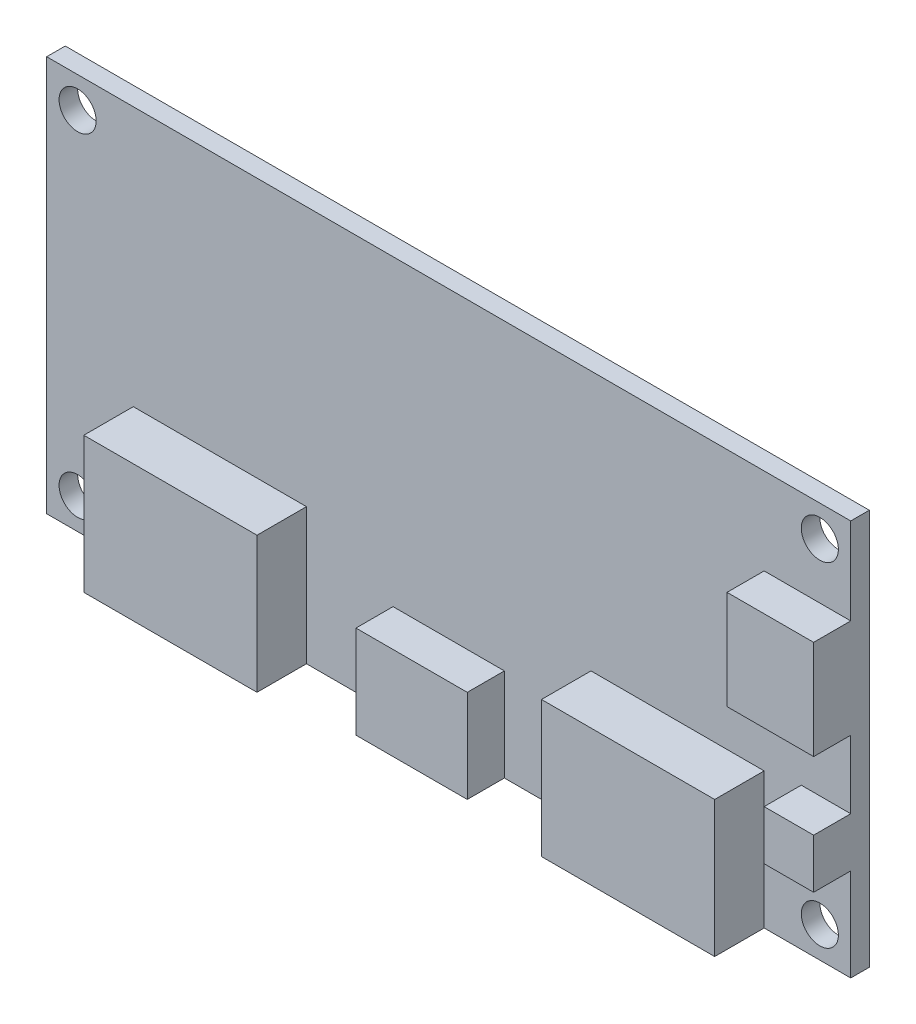
ISO-10303-21;
HEADER;
FILE_DESCRIPTION(('STEP AP214'),'2;1');
FILE_NAME('part.step','',(''),(''),'','','');
FILE_SCHEMA(('AUTOMOTIVE_DESIGN { 1 0 10303 214 1 1 1 1 }'));
ENDSEC;
DATA;
#1=APPLICATION_CONTEXT('core data for automotive mechanical design processes');
#2=APPLICATION_PROTOCOL_DEFINITION('international standard','automotive_design',2000,#1);
#3=PRODUCT_CONTEXT('',#1,'mechanical');
#4=PRODUCT('Part','Part','',(#3));
#5=PRODUCT_RELATED_PRODUCT_CATEGORY('part','',(#4));
#6=PRODUCT_DEFINITION_FORMATION('','',#4);
#7=PRODUCT_DEFINITION_CONTEXT('part definition',#1,'design');
#8=PRODUCT_DEFINITION('design','',#6,#7);
#9=PRODUCT_DEFINITION_SHAPE('','',#8);
#10=(LENGTH_UNIT() NAMED_UNIT(*) SI_UNIT(.MILLI.,.METRE.));
#11=(NAMED_UNIT(*) PLANE_ANGLE_UNIT() SI_UNIT($,.RADIAN.));
#12=(NAMED_UNIT(*) SI_UNIT($,.STERADIAN.) SOLID_ANGLE_UNIT());
#13=UNCERTAINTY_MEASURE_WITH_UNIT(LENGTH_MEASURE(1.E-05),#10,'distance_accuracy_value','');
#14=(GEOMETRIC_REPRESENTATION_CONTEXT(3) GLOBAL_UNCERTAINTY_ASSIGNED_CONTEXT((#13)) GLOBAL_UNIT_ASSIGNED_CONTEXT((#10,
#11,#12)) REPRESENTATION_CONTEXT('',''));
#15=CARTESIAN_POINT('',(0.,0.,0.));
#16=DIRECTION('',(0.,0.,1.));
#17=DIRECTION('',(1.,0.,0.));
#18=AXIS2_PLACEMENT_3D('',#15,#16,#17);
#19=CARTESIAN_POINT('',(0.,0.,1.5));
#20=DIRECTION('',(0.,0.,-1.));
#21=DIRECTION('',(-1.,0.,0.));
#22=AXIS2_PLACEMENT_3D('',#19,#20,#21);
#23=PLANE('',#22);
#24=CARTESIAN_POINT('',(62.5,2.5,1.5));
#25=DIRECTION('',(0.,0.,1.));
#26=DIRECTION('',(1.,0.,0.));
#27=AXIS2_PLACEMENT_3D('',#24,#25,#26);
#28=CIRCLE('',#27,1.5);
#29=CARTESIAN_POINT('',(64.,2.5,1.5));
#30=VERTEX_POINT('',#29);
#31=EDGE_CURVE('E341',#30,#30,#28,.T.);
#32=ORIENTED_EDGE('',*,*,#31,.F.);
#33=EDGE_LOOP('',(#32));
#34=FACE_BOUND('',#33,.T.);
#35=CARTESIAN_POINT('',(62.5,29.5,1.5));
#36=DIRECTION('',(0.,0.,1.));
#37=DIRECTION('',(1.,0.,0.));
#38=AXIS2_PLACEMENT_3D('',#35,#36,#37);
#39=CIRCLE('',#38,1.5);
#40=CARTESIAN_POINT('',(64.,29.5,1.5));
#41=VERTEX_POINT('',#40);
#42=EDGE_CURVE('E347',#41,#41,#39,.T.);
#43=ORIENTED_EDGE('',*,*,#42,.F.);
#44=EDGE_LOOP('',(#43));
#45=FACE_BOUND('',#44,.T.);
#46=CARTESIAN_POINT('',(2.5,29.5,1.5));
#47=DIRECTION('',(0.,0.,1.));
#48=DIRECTION('',(1.,0.,0.));
#49=AXIS2_PLACEMENT_3D('',#46,#47,#48);
#50=CIRCLE('',#49,1.5);
#51=CARTESIAN_POINT('',(4.,29.5,1.5));
#52=VERTEX_POINT('',#51);
#53=EDGE_CURVE('E353',#52,#52,#50,.T.);
#54=ORIENTED_EDGE('',*,*,#53,.F.);
#55=EDGE_LOOP('',(#54));
#56=FACE_BOUND('',#55,.T.);
#57=CARTESIAN_POINT('',(2.5,2.5,1.5));
#58=DIRECTION('',(0.,0.,1.));
#59=DIRECTION('',(1.,0.,0.));
#60=AXIS2_PLACEMENT_3D('',#57,#58,#59);
#61=CIRCLE('',#60,1.5);
#62=CARTESIAN_POINT('',(4.,2.5,1.5));
#63=VERTEX_POINT('',#62);
#64=EDGE_CURVE('E359',#63,#63,#61,.T.);
#65=ORIENTED_EDGE('',*,*,#64,.F.);
#66=EDGE_LOOP('',(#65));
#67=FACE_BOUND('',#66,.T.);
#68=DIRECTION('',(0.,-1.,0.));
#69=VECTOR('',#68,1.);
#70=CARTESIAN_POINT('',(28.,7.5,1.5));
#71=LINE('',#70,#69);
#72=CARTESIAN_POINT('',(28.,7.5,1.5));
#73=VERTEX_POINT('',#72);
#74=CARTESIAN_POINT('',(28.,0.,1.5));
#75=VERTEX_POINT('',#74);
#76=EDGE_CURVE('E48',#73,#75,#71,.T.);
#77=ORIENTED_EDGE('',*,*,#76,.F.);
#78=DIRECTION('',(-1.,0.,0.));
#79=VECTOR('',#78,1.);
#80=CARTESIAN_POINT('',(28.,7.5,1.5));
#81=LINE('',#80,#79);
#82=CARTESIAN_POINT('',(37.,7.5,1.5));
#83=VERTEX_POINT('',#82);
#84=EDGE_CURVE('E52',#83,#73,#81,.T.);
#85=ORIENTED_EDGE('',*,*,#84,.F.);
#86=DIRECTION('',(0.,1.,0.));
#87=VECTOR('',#86,1.);
#88=CARTESIAN_POINT('',(37.,7.5,1.5));
#89=LINE('',#88,#87);
#90=CARTESIAN_POINT('',(37.,0.,1.5));
#91=VERTEX_POINT('',#90);
#92=EDGE_CURVE('E719',#91,#83,#89,.T.);
#93=ORIENTED_EDGE('',*,*,#92,.F.);
#94=DIRECTION('',(1.,0.,0.));
#95=VECTOR('',#94,1.);
#96=CARTESIAN_POINT('',(0.,0.,1.5));
#97=LINE('',#96,#95);
#98=CARTESIAN_POINT('',(44.,0.,1.5));
#99=VERTEX_POINT('',#98);
#100=EDGE_CURVE('E374',#91,#99,#97,.T.);
#101=ORIENTED_EDGE('',*,*,#100,.T.);
#102=DIRECTION('',(0.,-1.,0.));
#103=VECTOR('',#102,1.);
#104=CARTESIAN_POINT('',(44.,11.,1.5));
#105=LINE('',#104,#103);
#106=CARTESIAN_POINT('',(44.,11.,1.5));
#107=VERTEX_POINT('',#106);
#108=EDGE_CURVE('E280',#107,#99,#105,.T.);
#109=ORIENTED_EDGE('',*,*,#108,.F.);
#110=DIRECTION('',(-1.,0.,0.));
#111=VECTOR('',#110,1.);
#112=CARTESIAN_POINT('',(44.,11.,1.5));
#113=LINE('',#112,#111);
#114=CARTESIAN_POINT('',(58.,11.,1.5));
#115=VERTEX_POINT('',#114);
#116=EDGE_CURVE('E285',#115,#107,#113,.T.);
#117=ORIENTED_EDGE('',*,*,#116,.F.);
#118=DIRECTION('',(0.,1.,0.));
#119=VECTOR('',#118,1.);
#120=CARTESIAN_POINT('',(58.,11.,1.5));
#121=LINE('',#120,#119);
#122=CARTESIAN_POINT('',(58.,0.,1.5));
#123=VERTEX_POINT('',#122);
#124=EDGE_CURVE('E294',#123,#115,#121,.T.);
#125=ORIENTED_EDGE('',*,*,#124,.F.);
#126=CARTESIAN_POINT('',(65.,0.,1.5));
#127=VERTEX_POINT('',#126);
#128=EDGE_CURVE('E368',#123,#127,#97,.T.);
#129=ORIENTED_EDGE('',*,*,#128,.T.);
#130=DIRECTION('',(0.,1.,0.));
#131=VECTOR('',#130,1.);
#132=CARTESIAN_POINT('',(65.,0.,1.5));
#133=LINE('',#132,#131);
#134=CARTESIAN_POINT('',(65.,7.5,1.5));
#135=VERTEX_POINT('',#134);
#136=EDGE_CURVE('E375',#127,#135,#133,.T.);
#137=ORIENTED_EDGE('',*,*,#136,.T.);
#138=DIRECTION('',(1.,0.,0.));
#139=VECTOR('',#138,1.);
#140=CARTESIAN_POINT('',(61.,7.5,1.5));
#141=LINE('',#140,#139);
#142=CARTESIAN_POINT('',(61.,7.5,1.5));
#143=VERTEX_POINT('',#142);
#144=EDGE_CURVE('E218',#143,#135,#141,.T.);
#145=ORIENTED_EDGE('',*,*,#144,.F.);
#146=DIRECTION('',(0.,-1.,0.));
#147=VECTOR('',#146,1.);
#148=CARTESIAN_POINT('',(61.,11.5,1.5));
#149=LINE('',#148,#147);
#150=CARTESIAN_POINT('',(61.,11.5,1.5));
#151=VERTEX_POINT('',#150);
#152=EDGE_CURVE('E215',#151,#143,#149,.T.);
#153=ORIENTED_EDGE('',*,*,#152,.F.);
#154=DIRECTION('',(-1.,0.,0.));
#155=VECTOR('',#154,1.);
#156=CARTESIAN_POINT('',(61.,11.5,1.5));
#157=LINE('',#156,#155);
#158=CARTESIAN_POINT('',(65.,11.5,1.5));
#159=VERTEX_POINT('',#158);
#160=EDGE_CURVE('E228',#159,#151,#157,.T.);
#161=ORIENTED_EDGE('',*,*,#160,.F.);
#162=CARTESIAN_POINT('',(65.,17.,1.5));
#163=VERTEX_POINT('',#162);
#164=EDGE_CURVE('E378',#159,#163,#133,.T.);
#165=ORIENTED_EDGE('',*,*,#164,.T.);
#166=DIRECTION('',(1.,0.,0.));
#167=VECTOR('',#166,1.);
#168=CARTESIAN_POINT('',(58.,17.,1.5));
#169=LINE('',#168,#167);
#170=CARTESIAN_POINT('',(58.,17.,1.5));
#171=VERTEX_POINT('',#170);
#172=EDGE_CURVE('E264',#171,#163,#169,.T.);
#173=ORIENTED_EDGE('',*,*,#172,.F.);
#174=DIRECTION('',(0.,-1.,0.));
#175=VECTOR('',#174,1.);
#176=CARTESIAN_POINT('',(58.,25.,1.5));
#177=LINE('',#176,#175);
#178=CARTESIAN_POINT('',(58.,25.,1.5));
#179=VERTEX_POINT('',#178);
#180=EDGE_CURVE('E250',#179,#171,#177,.T.);
#181=ORIENTED_EDGE('',*,*,#180,.F.);
#182=DIRECTION('',(-1.,0.,0.));
#183=VECTOR('',#182,1.);
#184=CARTESIAN_POINT('',(58.,25.,1.5));
#185=LINE('',#184,#183);
#186=CARTESIAN_POINT('',(65.,25.,1.5));
#187=VERTEX_POINT('',#186);
#188=EDGE_CURVE('E255',#187,#179,#185,.T.);
#189=ORIENTED_EDGE('',*,*,#188,.F.);
#190=CARTESIAN_POINT('',(65.,32.,1.5));
#191=VERTEX_POINT('',#190);
#192=EDGE_CURVE('E372',#187,#191,#133,.T.);
#193=ORIENTED_EDGE('',*,*,#192,.T.);
#194=DIRECTION('',(-1.,0.,0.));
#195=VECTOR('',#194,1.);
#196=CARTESIAN_POINT('',(0.,32.,1.5));
#197=LINE('',#196,#195);
#198=CARTESIAN_POINT('',(0.,32.,1.5));
#199=VERTEX_POINT('',#198);
#200=EDGE_CURVE('E377',#191,#199,#197,.T.);
#201=ORIENTED_EDGE('',*,*,#200,.T.);
#202=DIRECTION('',(0.,-1.,0.));
#203=VECTOR('',#202,1.);
#204=CARTESIAN_POINT('',(0.,0.,1.5));
#205=LINE('',#204,#203);
#206=CARTESIAN_POINT('',(0.,0.,1.5));
#207=VERTEX_POINT('',#206);
#208=EDGE_CURVE('E365',#199,#207,#205,.T.);
#209=ORIENTED_EDGE('',*,*,#208,.T.);
#210=CARTESIAN_POINT('',(7.00000000000001,0.,1.5));
#211=VERTEX_POINT('',#210);
#212=EDGE_CURVE('E370',#207,#211,#97,.T.);
#213=ORIENTED_EDGE('',*,*,#212,.T.);
#214=DIRECTION('',(0.,-1.,0.));
#215=VECTOR('',#214,1.);
#216=CARTESIAN_POINT('',(7.,11.,1.5));
#217=LINE('',#216,#215);
#218=CARTESIAN_POINT('',(7.,11.,1.5));
#219=VERTEX_POINT('',#218);
#220=EDGE_CURVE('E310',#219,#211,#217,.T.);
#221=ORIENTED_EDGE('',*,*,#220,.F.);
#222=DIRECTION('',(-1.,0.,0.));
#223=VECTOR('',#222,1.);
#224=CARTESIAN_POINT('',(7.,11.,1.5));
#225=LINE('',#224,#223);
#226=CARTESIAN_POINT('',(21.,11.,1.5));
#227=VERTEX_POINT('',#226);
#228=EDGE_CURVE('E315',#227,#219,#225,.T.);
#229=ORIENTED_EDGE('',*,*,#228,.F.);
#230=DIRECTION('',(0.,1.,0.));
#231=VECTOR('',#230,1.);
#232=CARTESIAN_POINT('',(21.,11.,1.5));
#233=LINE('',#232,#231);
#234=CARTESIAN_POINT('',(21.,0.,1.5));
#235=VERTEX_POINT('',#234);
#236=EDGE_CURVE('E324',#235,#227,#233,.T.);
#237=ORIENTED_EDGE('',*,*,#236,.F.);
#238=EDGE_CURVE('E373',#235,#75,#97,.T.);
#239=ORIENTED_EDGE('',*,*,#238,.T.);
#240=EDGE_LOOP('',(#77,#85,#93,#101,#109,#117,#125,#129,#137,#145,#153,#161,#165,#173,#181,#189,
#193,#201,#209,#213,#221,#229,#237,#239));
#241=FACE_BOUND('',#240,.T.);
#242=ADVANCED_FACE('F33',(#34,#45,#56,#67,#241),#23,.F.);
#243=CARTESIAN_POINT('',(0.,0.,0.));
#244=DIRECTION('',(0.,0.,-1.));
#245=DIRECTION('',(-1.,0.,0.));
#246=AXIS2_PLACEMENT_3D('',#243,#244,#245);
#247=PLANE('',#246);
#248=CARTESIAN_POINT('',(62.5,29.5,0.));
#249=DIRECTION('',(0.,0.,1.));
#250=DIRECTION('',(1.,0.,0.));
#251=AXIS2_PLACEMENT_3D('',#248,#249,#250);
#252=CIRCLE('',#251,1.5);
#253=CARTESIAN_POINT('',(64.,29.5,0.));
#254=VERTEX_POINT('',#253);
#255=EDGE_CURVE('E344',#254,#254,#252,.T.);
#256=ORIENTED_EDGE('',*,*,#255,.T.);
#257=EDGE_LOOP('',(#256));
#258=FACE_BOUND('',#257,.T.);
#259=CARTESIAN_POINT('',(2.5,2.5,0.));
#260=DIRECTION('',(0.,0.,1.));
#261=DIRECTION('',(1.,0.,0.));
#262=AXIS2_PLACEMENT_3D('',#259,#260,#261);
#263=CIRCLE('',#262,1.5);
#264=CARTESIAN_POINT('',(4.,2.5,0.));
#265=VERTEX_POINT('',#264);
#266=EDGE_CURVE('E356',#265,#265,#263,.T.);
#267=ORIENTED_EDGE('',*,*,#266,.T.);
#268=EDGE_LOOP('',(#267));
#269=FACE_BOUND('',#268,.T.);
#270=DIRECTION('',(0.,-1.,0.));
#271=VECTOR('',#270,1.);
#272=CARTESIAN_POINT('',(0.,0.,0.));
#273=LINE('',#272,#271);
#274=CARTESIAN_POINT('',(0.,32.,0.));
#275=VERTEX_POINT('',#274);
#276=CARTESIAN_POINT('',(0.,0.,0.));
#277=VERTEX_POINT('',#276);
#278=EDGE_CURVE('E362',#275,#277,#273,.T.);
#279=ORIENTED_EDGE('',*,*,#278,.F.);
#280=DIRECTION('',(-1.,0.,0.));
#281=VECTOR('',#280,1.);
#282=CARTESIAN_POINT('',(0.,32.,0.));
#283=LINE('',#282,#281);
#284=CARTESIAN_POINT('',(65.,32.,0.));
#285=VERTEX_POINT('',#284);
#286=EDGE_CURVE('E369',#285,#275,#283,.T.);
#287=ORIENTED_EDGE('',*,*,#286,.F.);
#288=DIRECTION('',(0.,1.,0.));
#289=VECTOR('',#288,1.);
#290=CARTESIAN_POINT('',(65.,0.,0.));
#291=LINE('',#290,#289);
#292=CARTESIAN_POINT('',(65.,0.,0.));
#293=VERTEX_POINT('',#292);
#294=EDGE_CURVE('E385',#293,#285,#291,.T.);
#295=ORIENTED_EDGE('',*,*,#294,.F.);
#296=DIRECTION('',(1.,0.,0.));
#297=VECTOR('',#296,1.);
#298=CARTESIAN_POINT('',(0.,0.,0.));
#299=LINE('',#298,#297);
#300=EDGE_CURVE('E383',#277,#293,#299,.T.);
#301=ORIENTED_EDGE('',*,*,#300,.F.);
#302=EDGE_LOOP('',(#279,#287,#295,#301));
#303=FACE_BOUND('',#302,.T.);
#304=CARTESIAN_POINT('',(2.5,29.5,0.));
#305=DIRECTION('',(0.,0.,1.));
#306=DIRECTION('',(1.,0.,0.));
#307=AXIS2_PLACEMENT_3D('',#304,#305,#306);
#308=CIRCLE('',#307,1.5);
#309=CARTESIAN_POINT('',(4.,29.5,0.));
#310=VERTEX_POINT('',#309);
#311=EDGE_CURVE('E350',#310,#310,#308,.T.);
#312=ORIENTED_EDGE('',*,*,#311,.T.);
#313=EDGE_LOOP('',(#312));
#314=FACE_BOUND('',#313,.T.);
#315=CARTESIAN_POINT('',(62.5,2.5,0.));
#316=DIRECTION('',(0.,0.,1.));
#317=DIRECTION('',(1.,0.,0.));
#318=AXIS2_PLACEMENT_3D('',#315,#316,#317);
#319=CIRCLE('',#318,1.5);
#320=CARTESIAN_POINT('',(64.,2.5,0.));
#321=VERTEX_POINT('',#320);
#322=EDGE_CURVE('E340',#321,#321,#319,.T.);
#323=ORIENTED_EDGE('',*,*,#322,.T.);
#324=EDGE_LOOP('',(#323));
#325=FACE_BOUND('',#324,.T.);
#326=ADVANCED_FACE('F402',(#258,#269,#303,#314,#325),#247,.T.);
#327=CARTESIAN_POINT('',(0.,0.,1.5));
#328=DIRECTION('',(1.,0.,0.));
#329=DIRECTION('',(0.,0.,-1.));
#330=AXIS2_PLACEMENT_3D('',#327,#328,#329);
#331=PLANE('',#330);
#332=ORIENTED_EDGE('',*,*,#278,.T.);
#333=DIRECTION('',(0.,0.,-1.));
#334=VECTOR('',#333,1.);
#335=CARTESIAN_POINT('',(0.,0.,1.5));
#336=LINE('',#335,#334);
#337=EDGE_CURVE('E11',#207,#277,#336,.T.);
#338=ORIENTED_EDGE('',*,*,#337,.F.);
#339=ORIENTED_EDGE('',*,*,#208,.F.);
#340=DIRECTION('',(0.,0.,-1.));
#341=VECTOR('',#340,1.);
#342=CARTESIAN_POINT('',(0.,32.,1.5));
#343=LINE('',#342,#341);
#344=EDGE_CURVE('E380',#199,#275,#343,.T.);
#345=ORIENTED_EDGE('',*,*,#344,.T.);
#346=EDGE_LOOP('',(#332,#338,#339,#345));
#347=FACE_BOUND('',#346,.T.);
#348=ADVANCED_FACE('F35',(#347),#331,.F.);
#349=CARTESIAN_POINT('',(0.,0.,1.5));
#350=DIRECTION('',(0.,1.,0.));
#351=DIRECTION('',(0.,0.,1.));
#352=AXIS2_PLACEMENT_3D('',#349,#350,#351);
#353=PLANE('',#352);
#354=ORIENTED_EDGE('',*,*,#300,.T.);
#355=DIRECTION('',(0.,0.,-1.));
#356=VECTOR('',#355,1.);
#357=CARTESIAN_POINT('',(65.,0.,1.5));
#358=LINE('',#357,#356);
#359=EDGE_CURVE('E41',#127,#293,#358,.T.);
#360=ORIENTED_EDGE('',*,*,#359,.F.);
#361=ORIENTED_EDGE('',*,*,#128,.F.);
#362=DIRECTION('',(0.,0.,-1.));
#363=VECTOR('',#362,1.);
#364=CARTESIAN_POINT('',(58.,0.,5.5));
#365=LINE('',#364,#363);
#366=CARTESIAN_POINT('',(58.,0.,5.5));
#367=VERTEX_POINT('',#366);
#368=EDGE_CURVE('E304',#367,#123,#365,.T.);
#369=ORIENTED_EDGE('',*,*,#368,.F.);
#370=DIRECTION('',(1.,0.,0.));
#371=VECTOR('',#370,1.);
#372=CARTESIAN_POINT('',(44.,0.,5.5));
#373=LINE('',#372,#371);
#374=CARTESIAN_POINT('',(44.,0.,5.5));
#375=VERTEX_POINT('',#374);
#376=EDGE_CURVE('E284',#375,#367,#373,.T.);
#377=ORIENTED_EDGE('',*,*,#376,.F.);
#378=DIRECTION('',(0.,0.,-1.));
#379=VECTOR('',#378,1.);
#380=CARTESIAN_POINT('',(44.,0.,5.5));
#381=LINE('',#380,#379);
#382=EDGE_CURVE('E307',#375,#99,#381,.T.);
#383=ORIENTED_EDGE('',*,*,#382,.T.);
#384=ORIENTED_EDGE('',*,*,#100,.F.);
#385=DIRECTION('',(0.,0.,-1.));
#386=VECTOR('',#385,1.);
#387=CARTESIAN_POINT('',(37.,0.,4.5));
#388=LINE('',#387,#386);
#389=CARTESIAN_POINT('',(37.,0.,4.5));
#390=VERTEX_POINT('',#389);
#391=EDGE_CURVE('E200',#390,#91,#388,.T.);
#392=ORIENTED_EDGE('',*,*,#391,.F.);
#393=DIRECTION('',(1.,0.,0.));
#394=VECTOR('',#393,1.);
#395=CARTESIAN_POINT('',(28.,0.,4.5));
#396=LINE('',#395,#394);
#397=CARTESIAN_POINT('',(28.,0.,4.5));
#398=VERTEX_POINT('',#397);
#399=EDGE_CURVE('E193',#398,#390,#396,.T.);
#400=ORIENTED_EDGE('',*,*,#399,.F.);
#401=DIRECTION('',(0.,0.,-1.));
#402=VECTOR('',#401,1.);
#403=CARTESIAN_POINT('',(28.,0.,4.5));
#404=LINE('',#403,#402);
#405=EDGE_CURVE('E198',#398,#75,#404,.T.);
#406=ORIENTED_EDGE('',*,*,#405,.T.);
#407=ORIENTED_EDGE('',*,*,#238,.F.);
#408=DIRECTION('',(0.,0.,-1.));
#409=VECTOR('',#408,1.);
#410=CARTESIAN_POINT('',(21.,0.,5.5));
#411=LINE('',#410,#409);
#412=CARTESIAN_POINT('',(21.,0.,5.5));
#413=VERTEX_POINT('',#412);
#414=EDGE_CURVE('E334',#413,#235,#411,.T.);
#415=ORIENTED_EDGE('',*,*,#414,.F.);
#416=DIRECTION('',(1.,0.,0.));
#417=VECTOR('',#416,1.);
#418=CARTESIAN_POINT('',(7.00000000000001,0.,5.5));
#419=LINE('',#418,#417);
#420=CARTESIAN_POINT('',(7.00000000000001,0.,5.5));
#421=VERTEX_POINT('',#420);
#422=EDGE_CURVE('E314',#421,#413,#419,.T.);
#423=ORIENTED_EDGE('',*,*,#422,.F.);
#424=DIRECTION('',(0.,0.,-1.));
#425=VECTOR('',#424,1.);
#426=CARTESIAN_POINT('',(7.00000000000001,0.,5.5));
#427=LINE('',#426,#425);
#428=EDGE_CURVE('E337',#421,#211,#427,.T.);
#429=ORIENTED_EDGE('',*,*,#428,.T.);
#430=ORIENTED_EDGE('',*,*,#212,.F.);
#431=ORIENTED_EDGE('',*,*,#337,.T.);
#432=EDGE_LOOP('',(#354,#360,#361,#369,#377,#383,#384,#392,#400,#406,#407,#415,#423,#429,#430,#431));
#433=FACE_BOUND('',#432,.T.);
#434=ADVANCED_FACE('F195',(#433),#353,.F.);
#435=CARTESIAN_POINT('',(65.,0.,1.5));
#436=DIRECTION('',(-1.,0.,0.));
#437=DIRECTION('',(0.,0.,1.));
#438=AXIS2_PLACEMENT_3D('',#435,#436,#437);
#439=PLANE('',#438);
#440=ORIENTED_EDGE('',*,*,#294,.T.);
#441=DIRECTION('',(0.,0.,-1.));
#442=VECTOR('',#441,1.);
#443=CARTESIAN_POINT('',(65.,32.,1.5));
#444=LINE('',#443,#442);
#445=EDGE_CURVE('E390',#191,#285,#444,.T.);
#446=ORIENTED_EDGE('',*,*,#445,.F.);
#447=ORIENTED_EDGE('',*,*,#192,.F.);
#448=DIRECTION('',(0.,0.,-1.));
#449=VECTOR('',#448,1.);
#450=CARTESIAN_POINT('',(65.,25.,4.5));
#451=LINE('',#450,#449);
#452=CARTESIAN_POINT('',(65.,25.,4.5));
#453=VERTEX_POINT('',#452);
#454=EDGE_CURVE('E271',#453,#187,#451,.T.);
#455=ORIENTED_EDGE('',*,*,#454,.F.);
#456=DIRECTION('',(0.,1.,0.));
#457=VECTOR('',#456,1.);
#458=CARTESIAN_POINT('',(65.,25.,4.5));
#459=LINE('',#458,#457);
#460=CARTESIAN_POINT('',(65.,17.,4.5));
#461=VERTEX_POINT('',#460);
#462=EDGE_CURVE('E257',#461,#453,#459,.T.);
#463=ORIENTED_EDGE('',*,*,#462,.F.);
#464=DIRECTION('',(0.,0.,-1.));
#465=VECTOR('',#464,1.);
#466=CARTESIAN_POINT('',(65.,17.,4.5));
#467=LINE('',#466,#465);
#468=EDGE_CURVE('E274',#461,#163,#467,.T.);
#469=ORIENTED_EDGE('',*,*,#468,.T.);
#470=ORIENTED_EDGE('',*,*,#164,.F.);
#471=DIRECTION('',(0.,0.,-1.));
#472=VECTOR('',#471,1.);
#473=CARTESIAN_POINT('',(65.,11.5,4.5));
#474=LINE('',#473,#472);
#475=CARTESIAN_POINT('',(65.,11.5,4.5));
#476=VERTEX_POINT('',#475);
#477=EDGE_CURVE('E241',#476,#159,#474,.T.);
#478=ORIENTED_EDGE('',*,*,#477,.F.);
#479=DIRECTION('',(0.,1.,0.));
#480=VECTOR('',#479,1.);
#481=CARTESIAN_POINT('',(65.,11.5,4.5));
#482=LINE('',#481,#480);
#483=CARTESIAN_POINT('',(65.,7.5,4.5));
#484=VERTEX_POINT('',#483);
#485=EDGE_CURVE('E230',#484,#476,#482,.T.);
#486=ORIENTED_EDGE('',*,*,#485,.F.);
#487=DIRECTION('',(0.,0.,-1.));
#488=VECTOR('',#487,1.);
#489=CARTESIAN_POINT('',(65.,7.5,4.5));
#490=LINE('',#489,#488);
#491=EDGE_CURVE('E244',#484,#135,#490,.T.);
#492=ORIENTED_EDGE('',*,*,#491,.T.);
#493=ORIENTED_EDGE('',*,*,#136,.F.);
#494=ORIENTED_EDGE('',*,*,#359,.T.);
#495=EDGE_LOOP('',(#440,#446,#447,#455,#463,#469,#470,#478,#486,#492,#493,#494));
#496=FACE_BOUND('',#495,.T.);
#497=ADVANCED_FACE('F397',(#496),#439,.F.);
#498=CARTESIAN_POINT('',(0.,32.,1.5));
#499=DIRECTION('',(0.,-1.,0.));
#500=DIRECTION('',(0.,0.,-1.));
#501=AXIS2_PLACEMENT_3D('',#498,#499,#500);
#502=PLANE('',#501);
#503=ORIENTED_EDGE('',*,*,#286,.T.);
#504=ORIENTED_EDGE('',*,*,#344,.F.);
#505=ORIENTED_EDGE('',*,*,#200,.F.);
#506=ORIENTED_EDGE('',*,*,#445,.T.);
#507=EDGE_LOOP('',(#503,#504,#505,#506));
#508=FACE_BOUND('',#507,.T.);
#509=ADVANCED_FACE('F406',(#508),#502,.F.);
#510=CARTESIAN_POINT('',(2.5,2.5,1.5));
#511=DIRECTION('',(0.,0.,-1.));
#512=DIRECTION('',(-1.,0.,0.));
#513=AXIS2_PLACEMENT_3D('',#510,#511,#512);
#514=CYLINDRICAL_SURFACE('',#513,1.5);
#515=ORIENTED_EDGE('',*,*,#64,.T.);
#516=EDGE_LOOP('',(#515));
#517=FACE_BOUND('',#516,.T.);
#518=ORIENTED_EDGE('',*,*,#266,.F.);
#519=EDGE_LOOP('',(#518));
#520=FACE_BOUND('',#519,.T.);
#521=ADVANCED_FACE('F449',(#517,#520),#514,.F.);
#522=CARTESIAN_POINT('',(2.5,29.5,1.5));
#523=DIRECTION('',(0.,0.,-1.));
#524=DIRECTION('',(-1.,0.,0.));
#525=AXIS2_PLACEMENT_3D('',#522,#523,#524);
#526=CYLINDRICAL_SURFACE('',#525,1.5);
#527=ORIENTED_EDGE('',*,*,#53,.T.);
#528=EDGE_LOOP('',(#527));
#529=FACE_BOUND('',#528,.T.);
#530=ORIENTED_EDGE('',*,*,#311,.F.);
#531=EDGE_LOOP('',(#530));
#532=FACE_BOUND('',#531,.T.);
#533=ADVANCED_FACE('F498',(#529,#532),#526,.F.);
#534=CARTESIAN_POINT('',(62.5,29.5,1.5));
#535=DIRECTION('',(0.,0.,-1.));
#536=DIRECTION('',(-1.,0.,0.));
#537=AXIS2_PLACEMENT_3D('',#534,#535,#536);
#538=CYLINDRICAL_SURFACE('',#537,1.5);
#539=ORIENTED_EDGE('',*,*,#42,.T.);
#540=EDGE_LOOP('',(#539));
#541=FACE_BOUND('',#540,.T.);
#542=ORIENTED_EDGE('',*,*,#255,.F.);
#543=EDGE_LOOP('',(#542));
#544=FACE_BOUND('',#543,.T.);
#545=ADVANCED_FACE('F506',(#541,#544),#538,.F.);
#546=CARTESIAN_POINT('',(62.5,2.5,1.5));
#547=DIRECTION('',(0.,0.,-1.));
#548=DIRECTION('',(-1.,0.,0.));
#549=AXIS2_PLACEMENT_3D('',#546,#547,#548);
#550=CYLINDRICAL_SURFACE('',#549,1.5);
#551=ORIENTED_EDGE('',*,*,#31,.T.);
#552=EDGE_LOOP('',(#551));
#553=FACE_BOUND('',#552,.T.);
#554=ORIENTED_EDGE('',*,*,#322,.F.);
#555=EDGE_LOOP('',(#554));
#556=FACE_BOUND('',#555,.T.);
#557=ADVANCED_FACE('F513',(#553,#556),#550,.F.);
#558=CARTESIAN_POINT('',(7.,11.,5.5));
#559=DIRECTION('',(1.,0.,0.));
#560=DIRECTION('',(0.,1.,0.));
#561=AXIS2_PLACEMENT_3D('',#558,#559,#560);
#562=PLANE('',#561);
#563=ORIENTED_EDGE('',*,*,#220,.T.);
#564=ORIENTED_EDGE('',*,*,#428,.F.);
#565=DIRECTION('',(0.,-1.,0.));
#566=VECTOR('',#565,1.);
#567=CARTESIAN_POINT('',(7.,11.,5.5));
#568=LINE('',#567,#566);
#569=CARTESIAN_POINT('',(7.,11.,5.5));
#570=VERTEX_POINT('',#569);
#571=EDGE_CURVE('E311',#570,#421,#568,.T.);
#572=ORIENTED_EDGE('',*,*,#571,.F.);
#573=DIRECTION('',(0.,0.,-1.));
#574=VECTOR('',#573,1.);
#575=CARTESIAN_POINT('',(7.,11.,5.5));
#576=LINE('',#575,#574);
#577=EDGE_CURVE('E321',#570,#219,#576,.T.);
#578=ORIENTED_EDGE('',*,*,#577,.T.);
#579=EDGE_LOOP('',(#563,#564,#572,#578));
#580=FACE_BOUND('',#579,.T.);
#581=ADVANCED_FACE('F521',(#580),#562,.F.);
#582=CARTESIAN_POINT('',(21.,11.,5.5));
#583=DIRECTION('',(-1.,0.,0.));
#584=DIRECTION('',(0.,0.,1.));
#585=AXIS2_PLACEMENT_3D('',#582,#583,#584);
#586=PLANE('',#585);
#587=ORIENTED_EDGE('',*,*,#236,.T.);
#588=DIRECTION('',(0.,0.,-1.));
#589=VECTOR('',#588,1.);
#590=CARTESIAN_POINT('',(21.,11.,5.5));
#591=LINE('',#590,#589);
#592=CARTESIAN_POINT('',(21.,11.,5.5));
#593=VERTEX_POINT('',#592);
#594=EDGE_CURVE('E331',#593,#227,#591,.T.);
#595=ORIENTED_EDGE('',*,*,#594,.F.);
#596=DIRECTION('',(0.,1.,0.));
#597=VECTOR('',#596,1.);
#598=CARTESIAN_POINT('',(21.,11.,5.5));
#599=LINE('',#598,#597);
#600=EDGE_CURVE('E317',#413,#593,#599,.T.);
#601=ORIENTED_EDGE('',*,*,#600,.F.);
#602=ORIENTED_EDGE('',*,*,#414,.T.);
#603=EDGE_LOOP('',(#587,#595,#601,#602));
#604=FACE_BOUND('',#603,.T.);
#605=ADVANCED_FACE('F531',(#604),#586,.F.);
#606=CARTESIAN_POINT('',(7.,11.,5.5));
#607=DIRECTION('',(0.,-1.,0.));
#608=DIRECTION('',(0.,0.,-1.));
#609=AXIS2_PLACEMENT_3D('',#606,#607,#608);
#610=PLANE('',#609);
#611=ORIENTED_EDGE('',*,*,#228,.T.);
#612=ORIENTED_EDGE('',*,*,#577,.F.);
#613=DIRECTION('',(-1.,0.,0.));
#614=VECTOR('',#613,1.);
#615=CARTESIAN_POINT('',(7.,11.,5.5));
#616=LINE('',#615,#614);
#617=EDGE_CURVE('E319',#593,#570,#616,.T.);
#618=ORIENTED_EDGE('',*,*,#617,.F.);
#619=ORIENTED_EDGE('',*,*,#594,.T.);
#620=EDGE_LOOP('',(#611,#612,#618,#619));
#621=FACE_BOUND('',#620,.T.);
#622=ADVANCED_FACE('F541',(#621),#610,.F.);
#623=CARTESIAN_POINT('',(0.,0.,5.5));
#624=DIRECTION('',(0.,0.,1.));
#625=DIRECTION('',(1.,0.,0.));
#626=AXIS2_PLACEMENT_3D('',#623,#624,#625);
#627=PLANE('',#626);
#628=ORIENTED_EDGE('',*,*,#571,.T.);
#629=ORIENTED_EDGE('',*,*,#422,.T.);
#630=ORIENTED_EDGE('',*,*,#600,.T.);
#631=ORIENTED_EDGE('',*,*,#617,.T.);
#632=EDGE_LOOP('',(#628,#629,#630,#631));
#633=FACE_BOUND('',#632,.T.);
#634=ADVANCED_FACE('F551',(#633),#627,.T.);
#635=CARTESIAN_POINT('',(44.,11.,5.5));
#636=DIRECTION('',(1.,0.,0.));
#637=DIRECTION('',(0.,1.,0.));
#638=AXIS2_PLACEMENT_3D('',#635,#636,#637);
#639=PLANE('',#638);
#640=ORIENTED_EDGE('',*,*,#108,.T.);
#641=ORIENTED_EDGE('',*,*,#382,.F.);
#642=DIRECTION('',(0.,-1.,0.));
#643=VECTOR('',#642,1.);
#644=CARTESIAN_POINT('',(44.,11.,5.5));
#645=LINE('',#644,#643);
#646=CARTESIAN_POINT('',(44.,11.,5.5));
#647=VERTEX_POINT('',#646);
#648=EDGE_CURVE('E281',#647,#375,#645,.T.);
#649=ORIENTED_EDGE('',*,*,#648,.F.);
#650=DIRECTION('',(0.,0.,-1.));
#651=VECTOR('',#650,1.);
#652=CARTESIAN_POINT('',(44.,11.,5.5));
#653=LINE('',#652,#651);
#654=EDGE_CURVE('E291',#647,#107,#653,.T.);
#655=ORIENTED_EDGE('',*,*,#654,.T.);
#656=EDGE_LOOP('',(#640,#641,#649,#655));
#657=FACE_BOUND('',#656,.T.);
#658=ADVANCED_FACE('F561',(#657),#639,.F.);
#659=CARTESIAN_POINT('',(58.,11.,5.5));
#660=DIRECTION('',(-1.,0.,0.));
#661=DIRECTION('',(0.,0.,1.));
#662=AXIS2_PLACEMENT_3D('',#659,#660,#661);
#663=PLANE('',#662);
#664=ORIENTED_EDGE('',*,*,#124,.T.);
#665=DIRECTION('',(0.,0.,-1.));
#666=VECTOR('',#665,1.);
#667=CARTESIAN_POINT('',(58.,11.,5.5));
#668=LINE('',#667,#666);
#669=CARTESIAN_POINT('',(58.,11.,5.5));
#670=VERTEX_POINT('',#669);
#671=EDGE_CURVE('E301',#670,#115,#668,.T.);
#672=ORIENTED_EDGE('',*,*,#671,.F.);
#673=DIRECTION('',(0.,1.,0.));
#674=VECTOR('',#673,1.);
#675=CARTESIAN_POINT('',(58.,11.,5.5));
#676=LINE('',#675,#674);
#677=EDGE_CURVE('E287',#367,#670,#676,.T.);
#678=ORIENTED_EDGE('',*,*,#677,.F.);
#679=ORIENTED_EDGE('',*,*,#368,.T.);
#680=EDGE_LOOP('',(#664,#672,#678,#679));
#681=FACE_BOUND('',#680,.T.);
#682=ADVANCED_FACE('F571',(#681),#663,.F.);
#683=CARTESIAN_POINT('',(44.,11.,5.5));
#684=DIRECTION('',(0.,-1.,0.));
#685=DIRECTION('',(1.,0.,0.));
#686=AXIS2_PLACEMENT_3D('',#683,#684,#685);
#687=PLANE('',#686);
#688=ORIENTED_EDGE('',*,*,#116,.T.);
#689=ORIENTED_EDGE('',*,*,#654,.F.);
#690=DIRECTION('',(-1.,0.,0.));
#691=VECTOR('',#690,1.);
#692=CARTESIAN_POINT('',(44.,11.,5.5));
#693=LINE('',#692,#691);
#694=EDGE_CURVE('E289',#670,#647,#693,.T.);
#695=ORIENTED_EDGE('',*,*,#694,.F.);
#696=ORIENTED_EDGE('',*,*,#671,.T.);
#697=EDGE_LOOP('',(#688,#689,#695,#696));
#698=FACE_BOUND('',#697,.T.);
#699=ADVANCED_FACE('F581',(#698),#687,.F.);
#700=CARTESIAN_POINT('',(0.,0.,5.5));
#701=DIRECTION('',(0.,0.,1.));
#702=DIRECTION('',(1.,0.,0.));
#703=AXIS2_PLACEMENT_3D('',#700,#701,#702);
#704=PLANE('',#703);
#705=ORIENTED_EDGE('',*,*,#648,.T.);
#706=ORIENTED_EDGE('',*,*,#376,.T.);
#707=ORIENTED_EDGE('',*,*,#677,.T.);
#708=ORIENTED_EDGE('',*,*,#694,.T.);
#709=EDGE_LOOP('',(#705,#706,#707,#708));
#710=FACE_BOUND('',#709,.T.);
#711=ADVANCED_FACE('F591',(#710),#704,.T.);
#712=CARTESIAN_POINT('',(58.,25.,4.5));
#713=DIRECTION('',(1.,0.,0.));
#714=DIRECTION('',(0.,0.,-1.));
#715=AXIS2_PLACEMENT_3D('',#712,#713,#714);
#716=PLANE('',#715);
#717=ORIENTED_EDGE('',*,*,#180,.T.);
#718=DIRECTION('',(0.,0.,-1.));
#719=VECTOR('',#718,1.);
#720=CARTESIAN_POINT('',(58.,17.,4.5));
#721=LINE('',#720,#719);
#722=CARTESIAN_POINT('',(58.,17.,4.5));
#723=VERTEX_POINT('',#722);
#724=EDGE_CURVE('E277',#723,#171,#721,.T.);
#725=ORIENTED_EDGE('',*,*,#724,.F.);
#726=DIRECTION('',(0.,-1.,0.));
#727=VECTOR('',#726,1.);
#728=CARTESIAN_POINT('',(58.,25.,4.5));
#729=LINE('',#728,#727);
#730=CARTESIAN_POINT('',(58.,25.,4.5));
#731=VERTEX_POINT('',#730);
#732=EDGE_CURVE('E251',#731,#723,#729,.T.);
#733=ORIENTED_EDGE('',*,*,#732,.F.);
#734=DIRECTION('',(0.,0.,-1.));
#735=VECTOR('',#734,1.);
#736=CARTESIAN_POINT('',(58.,25.,4.5));
#737=LINE('',#736,#735);
#738=EDGE_CURVE('E261',#731,#179,#737,.T.);
#739=ORIENTED_EDGE('',*,*,#738,.T.);
#740=EDGE_LOOP('',(#717,#725,#733,#739));
#741=FACE_BOUND('',#740,.T.);
#742=ADVANCED_FACE('F426',(#741),#716,.F.);
#743=CARTESIAN_POINT('',(58.,17.,4.5));
#744=DIRECTION('',(0.,1.,0.));
#745=DIRECTION('',(0.,0.,1.));
#746=AXIS2_PLACEMENT_3D('',#743,#744,#745);
#747=PLANE('',#746);
#748=ORIENTED_EDGE('',*,*,#172,.T.);
#749=ORIENTED_EDGE('',*,*,#468,.F.);
#750=DIRECTION('',(1.,0.,0.));
#751=VECTOR('',#750,1.);
#752=CARTESIAN_POINT('',(58.,17.,4.5));
#753=LINE('',#752,#751);
#754=EDGE_CURVE('E254',#723,#461,#753,.T.);
#755=ORIENTED_EDGE('',*,*,#754,.F.);
#756=ORIENTED_EDGE('',*,*,#724,.T.);
#757=EDGE_LOOP('',(#748,#749,#755,#756));
#758=FACE_BOUND('',#757,.T.);
#759=ADVANCED_FACE('F417',(#758),#747,.F.);
#760=CARTESIAN_POINT('',(58.,25.,4.5));
#761=DIRECTION('',(0.,-1.,0.));
#762=DIRECTION('',(0.,0.,-1.));
#763=AXIS2_PLACEMENT_3D('',#760,#761,#762);
#764=PLANE('',#763);
#765=ORIENTED_EDGE('',*,*,#188,.T.);
#766=ORIENTED_EDGE('',*,*,#738,.F.);
#767=DIRECTION('',(-1.,0.,0.));
#768=VECTOR('',#767,1.);
#769=CARTESIAN_POINT('',(58.,25.,4.5));
#770=LINE('',#769,#768);
#771=EDGE_CURVE('E259',#453,#731,#770,.T.);
#772=ORIENTED_EDGE('',*,*,#771,.F.);
#773=ORIENTED_EDGE('',*,*,#454,.T.);
#774=EDGE_LOOP('',(#765,#766,#772,#773));
#775=FACE_BOUND('',#774,.T.);
#776=ADVANCED_FACE('F428',(#775),#764,.F.);
#777=CARTESIAN_POINT('',(0.,0.,4.5));
#778=DIRECTION('',(0.,0.,1.));
#779=DIRECTION('',(1.,0.,0.));
#780=AXIS2_PLACEMENT_3D('',#777,#778,#779);
#781=PLANE('',#780);
#782=ORIENTED_EDGE('',*,*,#732,.T.);
#783=ORIENTED_EDGE('',*,*,#754,.T.);
#784=ORIENTED_EDGE('',*,*,#462,.T.);
#785=ORIENTED_EDGE('',*,*,#771,.T.);
#786=EDGE_LOOP('',(#782,#783,#784,#785));
#787=FACE_BOUND('',#786,.T.);
#788=ADVANCED_FACE('F422',(#787),#781,.T.);
#789=CARTESIAN_POINT('',(61.,11.5,4.5));
#790=DIRECTION('',(1.,0.,0.));
#791=DIRECTION('',(0.,0.,-1.));
#792=AXIS2_PLACEMENT_3D('',#789,#790,#791);
#793=PLANE('',#792);
#794=ORIENTED_EDGE('',*,*,#152,.T.);
#795=DIRECTION('',(0.,0.,-1.));
#796=VECTOR('',#795,1.);
#797=CARTESIAN_POINT('',(61.,7.5,4.5));
#798=LINE('',#797,#796);
#799=CARTESIAN_POINT('',(61.,7.5,4.5));
#800=VERTEX_POINT('',#799);
#801=EDGE_CURVE('E247',#800,#143,#798,.T.);
#802=ORIENTED_EDGE('',*,*,#801,.F.);
#803=DIRECTION('',(0.,-1.,0.));
#804=VECTOR('',#803,1.);
#805=CARTESIAN_POINT('',(61.,11.5,4.5));
#806=LINE('',#805,#804);
#807=CARTESIAN_POINT('',(61.,11.5,4.5));
#808=VERTEX_POINT('',#807);
#809=EDGE_CURVE('E224',#808,#800,#806,.T.);
#810=ORIENTED_EDGE('',*,*,#809,.F.);
#811=DIRECTION('',(0.,0.,-1.));
#812=VECTOR('',#811,1.);
#813=CARTESIAN_POINT('',(61.,11.5,4.5));
#814=LINE('',#813,#812);
#815=EDGE_CURVE('E233',#808,#151,#814,.T.);
#816=ORIENTED_EDGE('',*,*,#815,.T.);
#817=EDGE_LOOP('',(#794,#802,#810,#816));
#818=FACE_BOUND('',#817,.T.);
#819=ADVANCED_FACE('F435',(#818),#793,.F.);
#820=CARTESIAN_POINT('',(61.,7.5,4.5));
#821=DIRECTION('',(0.,1.,0.));
#822=DIRECTION('',(0.,0.,1.));
#823=AXIS2_PLACEMENT_3D('',#820,#821,#822);
#824=PLANE('',#823);
#825=ORIENTED_EDGE('',*,*,#144,.T.);
#826=ORIENTED_EDGE('',*,*,#491,.F.);
#827=DIRECTION('',(1.,0.,0.));
#828=VECTOR('',#827,1.);
#829=CARTESIAN_POINT('',(61.,7.5,4.5));
#830=LINE('',#829,#828);
#831=EDGE_CURVE('E227',#800,#484,#830,.T.);
#832=ORIENTED_EDGE('',*,*,#831,.F.);
#833=ORIENTED_EDGE('',*,*,#801,.T.);
#834=EDGE_LOOP('',(#825,#826,#832,#833));
#835=FACE_BOUND('',#834,.T.);
#836=ADVANCED_FACE('F646',(#835),#824,.F.);
#837=CARTESIAN_POINT('',(61.,11.5,4.5));
#838=DIRECTION('',(0.,-1.,0.));
#839=DIRECTION('',(1.,0.,0.));
#840=AXIS2_PLACEMENT_3D('',#837,#838,#839);
#841=PLANE('',#840);
#842=ORIENTED_EDGE('',*,*,#160,.T.);
#843=ORIENTED_EDGE('',*,*,#815,.F.);
#844=DIRECTION('',(-1.,0.,0.));
#845=VECTOR('',#844,1.);
#846=CARTESIAN_POINT('',(61.,11.5,4.5));
#847=LINE('',#846,#845);
#848=EDGE_CURVE('E232',#476,#808,#847,.T.);
#849=ORIENTED_EDGE('',*,*,#848,.F.);
#850=ORIENTED_EDGE('',*,*,#477,.T.);
#851=EDGE_LOOP('',(#842,#843,#849,#850));
#852=FACE_BOUND('',#851,.T.);
#853=ADVANCED_FACE('F656',(#852),#841,.F.);
#854=CARTESIAN_POINT('',(0.,0.,4.5));
#855=DIRECTION('',(0.,0.,1.));
#856=DIRECTION('',(1.,0.,0.));
#857=AXIS2_PLACEMENT_3D('',#854,#855,#856);
#858=PLANE('',#857);
#859=ORIENTED_EDGE('',*,*,#809,.T.);
#860=ORIENTED_EDGE('',*,*,#831,.T.);
#861=ORIENTED_EDGE('',*,*,#485,.T.);
#862=ORIENTED_EDGE('',*,*,#848,.T.);
#863=EDGE_LOOP('',(#859,#860,#861,#862));
#864=FACE_BOUND('',#863,.T.);
#865=ADVANCED_FACE('F666',(#864),#858,.T.);
#866=CARTESIAN_POINT('',(28.,7.5,4.5));
#867=DIRECTION('',(1.,0.,0.));
#868=DIRECTION('',(0.,0.,-1.));
#869=AXIS2_PLACEMENT_3D('',#866,#867,#868);
#870=PLANE('',#869);
#871=ORIENTED_EDGE('',*,*,#76,.T.);
#872=ORIENTED_EDGE('',*,*,#405,.F.);
#873=DIRECTION('',(0.,-1.,0.));
#874=VECTOR('',#873,1.);
#875=CARTESIAN_POINT('',(28.,7.5,4.5));
#876=LINE('',#875,#874);
#877=CARTESIAN_POINT('',(28.,7.5,4.5));
#878=VERTEX_POINT('',#877);
#879=EDGE_CURVE('E204',#878,#398,#876,.T.);
#880=ORIENTED_EDGE('',*,*,#879,.F.);
#881=DIRECTION('',(0.,0.,-1.));
#882=VECTOR('',#881,1.);
#883=CARTESIAN_POINT('',(28.,7.5,4.5));
#884=LINE('',#883,#882);
#885=EDGE_CURVE('E717',#878,#73,#884,.T.);
#886=ORIENTED_EDGE('',*,*,#885,.T.);
#887=EDGE_LOOP('',(#871,#872,#880,#886));
#888=FACE_BOUND('',#887,.T.);
#889=ADVANCED_FACE('F214',(#888),#870,.F.);
#890=CARTESIAN_POINT('',(37.,7.5,4.5));
#891=DIRECTION('',(-1.,0.,0.));
#892=DIRECTION('',(0.,0.,1.));
#893=AXIS2_PLACEMENT_3D('',#890,#891,#892);
#894=PLANE('',#893);
#895=ORIENTED_EDGE('',*,*,#92,.T.);
#896=DIRECTION('',(0.,0.,-1.));
#897=VECTOR('',#896,1.);
#898=CARTESIAN_POINT('',(37.,7.5,4.5));
#899=LINE('',#898,#897);
#900=CARTESIAN_POINT('',(37.,7.5,4.5));
#901=VERTEX_POINT('',#900);
#902=EDGE_CURVE('E220',#901,#83,#899,.T.);
#903=ORIENTED_EDGE('',*,*,#902,.F.);
#904=DIRECTION('',(0.,1.,0.));
#905=VECTOR('',#904,1.);
#906=CARTESIAN_POINT('',(37.,7.5,4.5));
#907=LINE('',#906,#905);
#908=EDGE_CURVE('E203',#390,#901,#907,.T.);
#909=ORIENTED_EDGE('',*,*,#908,.F.);
#910=ORIENTED_EDGE('',*,*,#391,.T.);
#911=EDGE_LOOP('',(#895,#903,#909,#910));
#912=FACE_BOUND('',#911,.T.);
#913=ADVANCED_FACE('F685',(#912),#894,.F.);
#914=CARTESIAN_POINT('',(28.,7.5,4.5));
#915=DIRECTION('',(0.,-1.,0.));
#916=DIRECTION('',(0.,0.,-1.));
#917=AXIS2_PLACEMENT_3D('',#914,#915,#916);
#918=PLANE('',#917);
#919=ORIENTED_EDGE('',*,*,#84,.T.);
#920=ORIENTED_EDGE('',*,*,#885,.F.);
#921=DIRECTION('',(-1.,0.,0.));
#922=VECTOR('',#921,1.);
#923=CARTESIAN_POINT('',(28.,7.5,4.5));
#924=LINE('',#923,#922);
#925=EDGE_CURVE('E209',#901,#878,#924,.T.);
#926=ORIENTED_EDGE('',*,*,#925,.F.);
#927=ORIENTED_EDGE('',*,*,#902,.T.);
#928=EDGE_LOOP('',(#919,#920,#926,#927));
#929=FACE_BOUND('',#928,.T.);
#930=ADVANCED_FACE('F694',(#929),#918,.F.);
#931=CARTESIAN_POINT('',(0.,0.,4.5));
#932=DIRECTION('',(0.,0.,1.));
#933=DIRECTION('',(1.,0.,0.));
#934=AXIS2_PLACEMENT_3D('',#931,#932,#933);
#935=PLANE('',#934);
#936=ORIENTED_EDGE('',*,*,#879,.T.);
#937=ORIENTED_EDGE('',*,*,#399,.T.);
#938=ORIENTED_EDGE('',*,*,#908,.T.);
#939=ORIENTED_EDGE('',*,*,#925,.T.);
#940=EDGE_LOOP('',(#936,#937,#938,#939));
#941=FACE_BOUND('',#940,.T.);
#942=ADVANCED_FACE('F207',(#941),#935,.T.);
#943=CLOSED_SHELL('',(#242,#326,#348,#434,#497,#509,#521,#533,#545,#557,#581,#605,#622,#634,
#658,#682,#699,#711,#742,#759,#776,#788,#819,#836,#853,#865,#889,#913,#930,#942));
#944=MANIFOLD_SOLID_BREP('B2',#943);
#945=ADVANCED_BREP_SHAPE_REPRESENTATION('',(#18,#944),#14);
#946=SHAPE_DEFINITION_REPRESENTATION(#9,#945);
ENDSEC;
END-ISO-10303-21;
